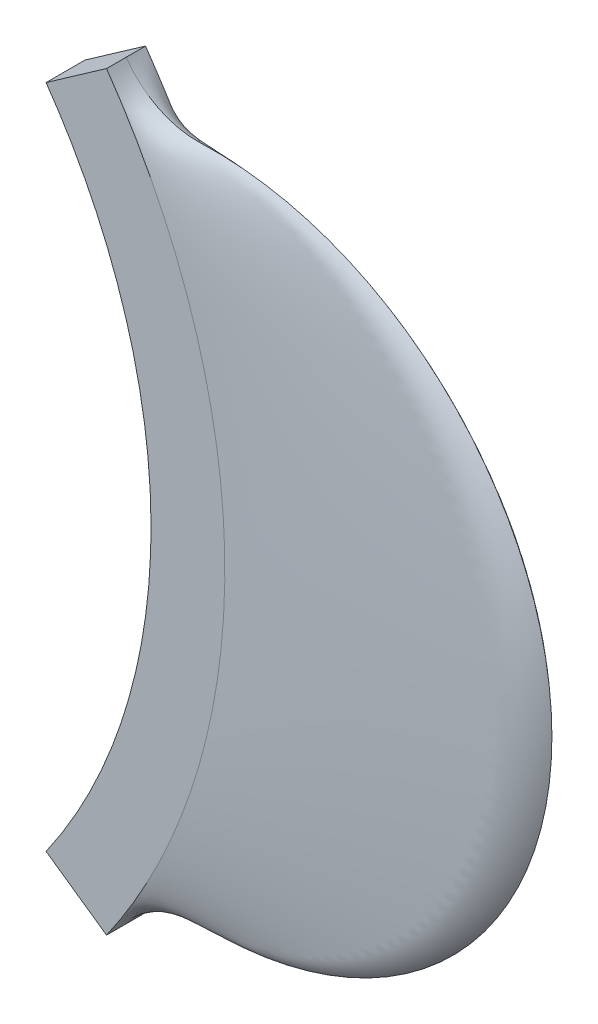
ISO-10303-21;
HEADER;
FILE_DESCRIPTION(('STEP AP214'),'2;1');
FILE_NAME('part.step','',(''),(''),'','','');
FILE_SCHEMA(('AUTOMOTIVE_DESIGN { 1 0 10303 214 1 1 1 1 }'));
ENDSEC;
DATA;
#1=APPLICATION_CONTEXT('core data for automotive mechanical design processes');
#2=APPLICATION_PROTOCOL_DEFINITION('international standard','automotive_design',2000,#1);
#3=PRODUCT_CONTEXT('',#1,'mechanical');
#4=PRODUCT('Part','Part','',(#3));
#5=PRODUCT_RELATED_PRODUCT_CATEGORY('part','',(#4));
#6=PRODUCT_DEFINITION_FORMATION('','',#4);
#7=PRODUCT_DEFINITION_CONTEXT('part definition',#1,'design');
#8=PRODUCT_DEFINITION('design','',#6,#7);
#9=PRODUCT_DEFINITION_SHAPE('','',#8);
#10=(LENGTH_UNIT() NAMED_UNIT(*) SI_UNIT(.MILLI.,.METRE.));
#11=(NAMED_UNIT(*) PLANE_ANGLE_UNIT() SI_UNIT($,.RADIAN.));
#12=(NAMED_UNIT(*) SI_UNIT($,.STERADIAN.) SOLID_ANGLE_UNIT());
#13=UNCERTAINTY_MEASURE_WITH_UNIT(LENGTH_MEASURE(1.E-05),#10,'distance_accuracy_value','');
#14=(GEOMETRIC_REPRESENTATION_CONTEXT(3) GLOBAL_UNCERTAINTY_ASSIGNED_CONTEXT((#13)) GLOBAL_UNIT_ASSIGNED_CONTEXT((#10,
#11,#12)) REPRESENTATION_CONTEXT('',''));
#15=CARTESIAN_POINT('',(0.,0.,0.));
#16=DIRECTION('',(0.,0.,1.));
#17=DIRECTION('',(1.,0.,0.));
#18=AXIS2_PLACEMENT_3D('',#15,#16,#17);
#19=CARTESIAN_POINT('',(2.08166817117217E-13,0.,0.));
#20=DIRECTION('',(0.,0.,1.));
#21=DIRECTION('',(1.,0.,0.));
#22=AXIS2_PLACEMENT_3D('',#19,#20,#21);
#23=PLANE('',#22);
#24=CARTESIAN_POINT('',(2.08166817117217E-13,0.,0.));
#25=DIRECTION('',(0.,0.,-1.));
#26=DIRECTION('',(1.,0.,0.));
#27=AXIS2_PLACEMENT_3D('',#24,#25,#26);
#28=CIRCLE('',#27,94.3660254037843);
#29=CARTESIAN_POINT('',(77.3001226209369,54.1261285637151,0.));
#30=VERTEX_POINT('',#29);
#31=CARTESIAN_POINT('',(77.3001226209369,-54.1261285637151,0.));
#32=VERTEX_POINT('',#31);
#33=EDGE_CURVE('E438',#30,#32,#28,.T.);
#34=ORIENTED_EDGE('',*,*,#33,.F.);
#35=DIRECTION('',(-0.819152044288992,-0.573576436351046,0.));
#36=VECTOR('',#35,1.);
#37=CARTESIAN_POINT('',(77.3001226209369,54.1261285637151,0.));
#38=LINE('',#37,#36);
#39=CARTESIAN_POINT('',(87.1299471524047,61.0090457999276,0.));
#40=VERTEX_POINT('',#39);
#41=EDGE_CURVE('E206',#40,#30,#38,.T.);
#42=ORIENTED_EDGE('',*,*,#41,.F.);
#43=CARTESIAN_POINT('',(2.08166817117217E-13,0.,0.));
#44=DIRECTION('',(0.,0.,1.));
#45=DIRECTION('',(1.,0.,0.));
#46=AXIS2_PLACEMENT_3D('',#43,#44,#45);
#47=CIRCLE('',#46,106.366025403784);
#48=CARTESIAN_POINT('',(87.1299471524048,-61.0090457999277,0.));
#49=VERTEX_POINT('',#48);
#50=EDGE_CURVE('E146',#49,#40,#47,.T.);
#51=ORIENTED_EDGE('',*,*,#50,.F.);
#52=DIRECTION('',(0.819152044288991,-0.573576436351047,0.));
#53=VECTOR('',#52,1.);
#54=CARTESIAN_POINT('',(77.3001226209369,-54.1261285637151,0.));
#55=LINE('',#54,#53);
#56=EDGE_CURVE('E13',#32,#49,#55,.T.);
#57=ORIENTED_EDGE('',*,*,#56,.F.);
#58=EDGE_LOOP('',(#34,#42,#51,#57));
#59=FACE_BOUND('',#58,.T.);
#60=ADVANCED_FACE('F135',(#59),#23,.F.);
#61=CARTESIAN_POINT('',(77.3001226209369,54.1261285637151,3.175));
#62=DIRECTION('',(-0.573576436351046,0.819152044288992,0.));
#63=DIRECTION('',(0.819152044288992,0.573576436351046,0.));
#64=AXIS2_PLACEMENT_3D('',#61,#62,#63);
#65=PLANE('',#64);
#66=DIRECTION('',(0.,0.,-1.));
#67=VECTOR('',#66,1.);
#68=CARTESIAN_POINT('',(77.3001226209369,54.1261285637151,1.5875));
#69=LINE('',#68,#67);
#70=CARTESIAN_POINT('',(77.3001226209369,54.1261285637151,3.175));
#71=VERTEX_POINT('',#70);
#72=EDGE_CURVE('E197',#71,#30,#69,.T.);
#73=ORIENTED_EDGE('',*,*,#72,.F.);
#74=DIRECTION('',(0.,0.,1.));
#75=VECTOR('',#74,1.);
#76=CARTESIAN_POINT('',(77.3001226209369,54.1261285637151,4.7625));
#77=LINE('',#76,#75);
#78=CARTESIAN_POINT('',(77.3001226209369,54.1261285637151,6.35));
#79=VERTEX_POINT('',#78);
#80=EDGE_CURVE('E202',#71,#79,#77,.T.);
#81=ORIENTED_EDGE('',*,*,#80,.T.);
#82=CARTESIAN_POINT('',(87.1299471524047,61.0090457999276,6.35));
#83=DIRECTION('',(-0.819152044288992,-0.573576436351045,0.));
#84=VECTOR('',#83,1.);
#85=LINE('',#82,#84);
#86=CARTESIAN_POINT('',(87.1299471524047,61.0090457999276,6.35));
#87=VERTEX_POINT('',#86);
#88=EDGE_CURVE('E335',#87,#79,#85,.T.);
#89=ORIENTED_EDGE('',*,*,#88,.F.);
#90=DIRECTION('',(0.,0.,1.));
#91=VECTOR('',#90,1.);
#92=CARTESIAN_POINT('',(87.1299471524048,61.0090457999277,4.7625));
#93=LINE('',#92,#91);
#94=CARTESIAN_POINT('',(87.1299471524048,61.0090457999277,3.175));
#95=VERTEX_POINT('',#94);
#96=EDGE_CURVE('E230',#95,#87,#93,.T.);
#97=ORIENTED_EDGE('',*,*,#96,.F.);
#98=DIRECTION('',(0.,0.,-1.));
#99=VECTOR('',#98,1.);
#100=CARTESIAN_POINT('',(87.1299471524048,61.0090457999277,1.5875));
#101=LINE('',#100,#99);
#102=EDGE_CURVE('E209',#95,#40,#101,.T.);
#103=ORIENTED_EDGE('',*,*,#102,.T.);
#104=ORIENTED_EDGE('',*,*,#41,.T.);
#105=EDGE_LOOP('',(#73,#81,#89,#97,#103,#104));
#106=FACE_BOUND('',#105,.T.);
#107=ADVANCED_FACE('F199',(#106),#65,.T.);
#108=CARTESIAN_POINT('',(77.3001226209369,-54.1261285637151,3.175));
#109=CARTESIAN_POINT('',(77.3001226209369,-54.1261285637151,3.0281756079608));
#110=CARTESIAN_POINT('',(77.3001226209369,-54.1261285637151,2.8813512159216));
#111=CARTESIAN_POINT('',(77.3001226209369,-54.1261285637151,1.82301788258827));
#112=CARTESIAN_POINT('',(77.3001226209369,-54.1261285637151,0.911508941294133));
#113=CARTESIAN_POINT('',(77.3001226209369,-54.1261285637151,0.));
#114=CARTESIAN_POINT('',(80.055436798701,-50.191132112793,3.175));
#115=CARTESIAN_POINT('',(80.055436798701,-50.191132112793,3.0281756079608));
#116=CARTESIAN_POINT('',(80.055436798701,-50.191132112793,2.8813512159216));
#117=CARTESIAN_POINT('',(80.055436798701,-50.191132112793,1.82301788258827));
#118=CARTESIAN_POINT('',(80.055436798701,-50.191132112793,0.911508941294133));
#119=CARTESIAN_POINT('',(80.055436798701,-50.191132112793,0.));
#120=CARTESIAN_POINT('',(84.9640400716013,-41.8996473461581,3.17499999999999));
#121=CARTESIAN_POINT('',(84.9640400716013,-41.8996473461581,3.02817560796079));
#122=CARTESIAN_POINT('',(84.9640400716013,-41.8996473461581,2.88135121592159));
#123=CARTESIAN_POINT('',(84.9640400716013,-41.8996473461581,1.82301788258826));
#124=CARTESIAN_POINT('',(84.9640400716013,-41.8996473461581,0.911508941294131));
#125=CARTESIAN_POINT('',(84.9640400716013,-41.8996473461581,0.));
#126=CARTESIAN_POINT('',(90.349032062118,-28.4869304821183,3.17500000000001));
#127=CARTESIAN_POINT('',(90.349032062118,-28.4869304821183,3.02817560796081));
#128=CARTESIAN_POINT('',(90.349032062118,-28.4869304821183,2.88135121592161));
#129=CARTESIAN_POINT('',(90.3490320621181,-28.4869304821183,1.82301788258827));
#130=CARTESIAN_POINT('',(90.3490320621182,-28.4869304821183,0.911508941294135));
#131=CARTESIAN_POINT('',(90.3490320621183,-28.4869304821184,0.));
#132=CARTESIAN_POINT('',(93.6310738350607,-14.4112069168914,3.17499999999999));
#133=CARTESIAN_POINT('',(93.6310738350606,-14.4112069168914,3.02817560796079));
#134=CARTESIAN_POINT('',(93.6310738350606,-14.4112069168914,2.88135121592159));
#135=CARTESIAN_POINT('',(93.6310738350604,-14.4112069168914,1.82301788258826));
#136=CARTESIAN_POINT('',(93.6310738350602,-14.4112069168914,0.911508941294131));
#137=CARTESIAN_POINT('',(93.63107383506,-14.4112069168914,0.));
#138=CARTESIAN_POINT('',(94.7336039840116,0.,3.175));
#139=CARTESIAN_POINT('',(94.7336039840116,0.,3.0281756079608));
#140=CARTESIAN_POINT('',(94.7336039840116,0.,2.8813512159216));
#141=CARTESIAN_POINT('',(94.7336039840119,0.,1.82301788258827));
#142=CARTESIAN_POINT('',(94.7336039840121,0.,0.911508941294134));
#143=CARTESIAN_POINT('',(94.7336039840124,0.,0.));
#144=CARTESIAN_POINT('',(93.6310738350608,14.4112069168916,3.175));
#145=CARTESIAN_POINT('',(93.6310738350607,14.4112069168916,3.0281756079608));
#146=CARTESIAN_POINT('',(93.6310738350607,14.4112069168916,2.8813512159216));
#147=CARTESIAN_POINT('',(93.6310738350605,14.4112069168915,1.82301788258827));
#148=CARTESIAN_POINT('',(93.6310738350603,14.4112069168915,0.911508941294133));
#149=CARTESIAN_POINT('',(93.6310738350601,14.4112069168914,0.));
#150=CARTESIAN_POINT('',(90.3490320621178,28.4869304821183,3.175));
#151=CARTESIAN_POINT('',(90.3490320621179,28.4869304821183,3.0281756079608));
#152=CARTESIAN_POINT('',(90.3490320621179,28.4869304821183,2.8813512159216));
#153=CARTESIAN_POINT('',(90.3490320621181,28.4869304821183,1.82301788258827));
#154=CARTESIAN_POINT('',(90.3490320621182,28.4869304821184,0.911508941294134));
#155=CARTESIAN_POINT('',(90.3490320621184,28.4869304821184,0.));
#156=CARTESIAN_POINT('',(84.9640400716016,41.8996473461583,3.175));
#157=CARTESIAN_POINT('',(84.9640400716015,41.8996473461583,3.0281756079608));
#158=CARTESIAN_POINT('',(84.9640400716015,41.8996473461583,2.8813512159216));
#159=CARTESIAN_POINT('',(84.9640400716014,41.8996473461582,1.82301788258827));
#160=CARTESIAN_POINT('',(84.9640400716013,41.8996473461582,0.911508941294133));
#161=CARTESIAN_POINT('',(84.9640400716012,41.8996473461581,0.));
#162=CARTESIAN_POINT('',(80.055436798701,50.191132112793,3.175));
#163=CARTESIAN_POINT('',(80.055436798701,50.191132112793,3.0281756079608));
#164=CARTESIAN_POINT('',(80.055436798701,50.191132112793,2.8813512159216));
#165=CARTESIAN_POINT('',(80.055436798701,50.191132112793,1.82301788258827));
#166=CARTESIAN_POINT('',(80.055436798701,50.191132112793,0.911508941294133));
#167=CARTESIAN_POINT('',(80.055436798701,50.191132112793,0.));
#168=CARTESIAN_POINT('',(77.3001226209369,54.1261285637151,3.175));
#169=CARTESIAN_POINT('',(77.3001226209369,54.1261285637151,3.0281756079608));
#170=CARTESIAN_POINT('',(77.3001226209369,54.1261285637151,2.8813512159216));
#171=CARTESIAN_POINT('',(77.3001226209369,54.1261285637151,1.82301788258827));
#172=CARTESIAN_POINT('',(77.3001226209369,54.1261285637151,0.911508941294133));
#173=CARTESIAN_POINT('',(77.3001226209369,54.1261285637151,0.));
#174=B_SPLINE_SURFACE_WITH_KNOTS('',3,3,((#108,#109,#110,#111,#112,#113),(#114,#115,#116,#117,
#118,#119),(#120,#121,#122,#123,#124,#125),(#126,#127,#128,#129,#130,#131),(#132,#133,#134,#135,
#136,#137),(#138,#139,#140,#141,#142,#143),(#144,#145,#146,#147,#148,#149),(#150,#151,#152,#153,
#154,#155),(#156,#157,#158,#159,#160,#161),(#162,#163,#164,#165,#166,#167),(#168,#169,#170,#171,
#172,#173)),.UNSPECIFIED.,.F.,.F.,.F.,(4,1,1,1,1,1,1,1,4),(4,2,4),(0.0861512886353095,
0.189613466476482,0.293075644317655,0.396537822158827,0.5,0.603462177841173,0.706924355682345,
0.810386533523518,0.91384871136469),(0.,0.138731709013417,1.),.UNSPECIFIED.);
#175=CARTESIAN_POINT('',(0.,0.,3.175));
#176=DIRECTION('',(0.,0.,-1.));
#177=DIRECTION('',(1.,0.,0.));
#178=AXIS2_PLACEMENT_3D('',#175,#176,#177);
#179=CIRCLE('',#178,94.3660254037844);
#180=CARTESIAN_POINT('',(77.3001226209369,-54.1261285637151,3.175));
#181=VERTEX_POINT('',#180);
#182=EDGE_CURVE('E213',#71,#181,#179,.T.);
#183=DIRECTION('',(0.,0.,-1.));
#184=VECTOR('',#183,1.);
#185=CARTESIAN_POINT('',(77.3001226209369,-54.1261285637151,1.5875));
#186=LINE('',#185,#184);
#187=EDGE_CURVE('E210',#181,#32,#186,.T.);
#188=ORIENTED_EDGE('',*,*,#182,.F.);
#189=ORIENTED_EDGE('',*,*,#72,.T.);
#190=ORIENTED_EDGE('',*,*,#33,.T.);
#191=ORIENTED_EDGE('',*,*,#187,.F.);
#192=EDGE_LOOP('',(#188,#189,#190,#191));
#193=FACE_BOUND('',#192,.T.);
#194=ADVANCED_FACE('F215',(#193),#174,.T.);
#195=CARTESIAN_POINT('',(87.1299471524048,-61.0090457999277,3.175));
#196=DIRECTION('',(-0.573576436351047,-0.819152044288991,0.));
#197=DIRECTION('',(-0.819152044288991,0.573576436351047,0.));
#198=AXIS2_PLACEMENT_3D('',#195,#196,#197);
#199=PLANE('',#198);
#200=DIRECTION('',(0.,0.,-1.));
#201=VECTOR('',#200,1.);
#202=CARTESIAN_POINT('',(87.1299471524048,-61.0090457999277,1.5875));
#203=LINE('',#202,#201);
#204=CARTESIAN_POINT('',(87.1299471524048,-61.0090457999277,3.175));
#205=VERTEX_POINT('',#204);
#206=EDGE_CURVE('E154',#205,#49,#203,.T.);
#207=ORIENTED_EDGE('',*,*,#206,.F.);
#208=DIRECTION('',(0.,0.,1.));
#209=VECTOR('',#208,1.);
#210=CARTESIAN_POINT('',(87.1299471524048,-61.0090457999277,4.7625));
#211=LINE('',#210,#209);
#212=CARTESIAN_POINT('',(87.1299471524048,-61.0090457999277,6.35));
#213=VERTEX_POINT('',#212);
#214=EDGE_CURVE('E234',#205,#213,#211,.T.);
#215=ORIENTED_EDGE('',*,*,#214,.T.);
#216=CARTESIAN_POINT('',(77.3001226209369,-54.1261285637151,6.35));
#217=DIRECTION('',(0.819152044288991,-0.573576436351047,0.));
#218=VECTOR('',#217,1.);
#219=LINE('',#216,#218);
#220=CARTESIAN_POINT('',(77.3001226209369,-54.1261285637151,6.35));
#221=VERTEX_POINT('',#220);
#222=EDGE_CURVE('E221',#221,#213,#219,.T.);
#223=ORIENTED_EDGE('',*,*,#222,.F.);
#224=DIRECTION('',(0.,0.,1.));
#225=VECTOR('',#224,1.);
#226=CARTESIAN_POINT('',(77.3001226209369,-54.1261285637151,4.7625));
#227=LINE('',#226,#225);
#228=EDGE_CURVE('E231',#181,#221,#227,.T.);
#229=ORIENTED_EDGE('',*,*,#228,.F.);
#230=ORIENTED_EDGE('',*,*,#187,.T.);
#231=ORIENTED_EDGE('',*,*,#56,.T.);
#232=EDGE_LOOP('',(#207,#215,#223,#229,#230,#231));
#233=FACE_BOUND('',#232,.T.);
#234=ADVANCED_FACE('F359',(#233),#199,.T.);
#235=CARTESIAN_POINT('',(87.1299471524048,61.0090457999277,3.175));
#236=CARTESIAN_POINT('',(87.1299471524048,61.0090457999277,3.0281756079608));
#237=CARTESIAN_POINT('',(87.1299471524048,61.0090457999277,2.8813512159216));
#238=CARTESIAN_POINT('',(87.1299471524047,61.0090457999275,1.82301788258826));
#239=CARTESIAN_POINT('',(87.1299471524047,61.0090457999276,0.911508941294133));
#240=CARTESIAN_POINT('',(87.1299471524047,61.0090457999276,0.));
#241=CARTESIAN_POINT('',(87.803313766193,60.0473786126392,3.175));
#242=CARTESIAN_POINT('',(87.7930797969314,60.0619942354413,3.0281756079608));
#243=CARTESIAN_POINT('',(87.7828458276699,60.0766098582433,2.8813512159216));
#244=CARTESIAN_POINT('',(87.7090777660319,60.1819615684324,1.82301788258826));
#245=CARTESIAN_POINT('',(87.6455436736558,60.2726976558197,0.911508941294133));
#246=CARTESIAN_POINT('',(87.5820095812796,60.3634337432069,0.));
#247=CARTESIAN_POINT('',(89.3812948487653,58.3052215338683,3.175));
#248=CARTESIAN_POINT('',(89.3411440613296,58.3397336511201,3.02436454269294));
#249=CARTESIAN_POINT('',(89.2995419895995,58.374245768372,2.8755020453143));
#250=CARTESIAN_POINT('',(88.9976711324947,58.6230145429891,1.8188719534916));
#251=CARTESIAN_POINT('',(88.7391503003198,58.8372712003546,0.909244667411953));
#252=CARTESIAN_POINT('',(88.4791498319719,59.0515278577201,0.));
#253=CARTESIAN_POINT('',(92.3050616818892,56.3556686135344,3.175));
#254=CARTESIAN_POINT('',(92.1968401400165,56.3875713140972,3.00802062207226));
#255=CARTESIAN_POINT('',(92.0809434174732,56.41947401466,2.8504176205188));
#256=CARTESIAN_POINT('',(91.2349826237456,56.6494337029648,1.80109195464819));
#257=CARTESIAN_POINT('',(90.5141626797517,56.8474906907071,0.899534229517888));
#258=CARTESIAN_POINT('',(89.7855176149355,57.0455476784494,0.));
#259=CARTESIAN_POINT('',(95.6380439813342,55.1725992437705,3.175));
#260=CARTESIAN_POINT('',(95.4442694263398,55.1659135852535,2.9818552518174));
#261=CARTESIAN_POINT('',(95.2328557073146,55.1592279267364,2.81025936977606));
#262=CARTESIAN_POINT('',(93.6846856208011,55.1110366475791,1.77262753269791));
#263=CARTESIAN_POINT('',(92.36917418328,55.069531026939,0.883988559128766));
#264=CARTESIAN_POINT('',(91.0356789880245,55.0280254062988,0.));
#265=CARTESIAN_POINT('',(98.0254626926317,54.9540878466485,3.175));
#266=CARTESIAN_POINT('',(97.7673325839329,54.8957496754654,2.95840128728118));
#267=CARTESIAN_POINT('',(97.4826318529401,54.8374115042823,2.77426254727431));
#268=CARTESIAN_POINT('',(95.393910176905,54.4169007818381,1.74711275738751));
#269=CARTESIAN_POINT('',(93.6218913726007,54.0547282305773,0.870053820256475));
#270=CARTESIAN_POINT('',(91.8227828698645,53.6925556793164,0.));
#271=CARTESIAN_POINT('',(102.901499182134,55.1398867608937,3.175));
#272=CARTESIAN_POINT('',(102.510903032089,54.9491310994061,2.90540690433583));
#273=CARTESIAN_POINT('',(102.073555572655,54.7583754379184,2.69292749649738));
#274=CARTESIAN_POINT('',(98.8567690824435,53.3833785980163,1.68946195931133));
#275=CARTESIAN_POINT('',(96.1336381789742,52.1991374196021,0.838568188609798));
#276=CARTESIAN_POINT('',(93.3628426458004,51.0148962411878,0.));
#277=CARTESIAN_POINT('',(110.279787768618,54.6825066323353,3.175));
#278=CARTESIAN_POINT('',(109.692247272512,54.3231811602195,2.80020455294495));
#279=CARTESIAN_POINT('',(109.01789356579,53.9638556881038,2.53146437311214));
#280=CARTESIAN_POINT('',(104.037614398635,51.3737811141575,1.5750158769137));
#281=CARTESIAN_POINT('',(99.8362483479639,49.1430320123273,0.776064158934173));
#282=CARTESIAN_POINT('',(95.5463731284263,46.9122829104969,0.));
#283=CARTESIAN_POINT('',(121.007455091683,51.7986744552114,3.17499999999999));
#284=CARTESIAN_POINT('',(120.142981725646,51.2794762044392,2.58898230287498));
#285=CARTESIAN_POINT('',(119.111260017958,50.760277953667,2.20728336599721));
#286=CARTESIAN_POINT('',(111.444359067087,47.0178152213583,1.34523433005547));
#287=CARTESIAN_POINT('',(105.010616768378,43.794550739822,0.650570368995281));
#288=CARTESIAN_POINT('',(98.4063588118717,40.5712862582855,0.));
#289=CARTESIAN_POINT('',(130.957087432339,46.8248400084104,3.17500000000001));
#290=CARTESIAN_POINT('',(129.844643111399,46.2349150895345,2.34713496041177));
#291=CARTESIAN_POINT('',(128.472853036367,45.6449901706586,1.8360993878802));
#292=CARTESIAN_POINT('',(118.227984641784,41.3927184797012,1.08213678026445));
#293=CARTESIAN_POINT('',(109.66726706525,37.7303717076197,0.506881247312757));
#294=CARTESIAN_POINT('',(100.84213722956,34.0680249355383,0.));
#295=CARTESIAN_POINT('',(139.720372916799,39.9562148686776,3.175));
#296=CARTESIAN_POINT('',(138.398109442489,39.3768449064023,2.0974561561456));
#297=CARTESIAN_POINT('',(136.721420518026,38.797474944127,1.45289578979597));
#298=CARTESIAN_POINT('',(124.147989286727,34.621285042082,0.810519647869587));
#299=CARTESIAN_POINT('',(113.678123438081,31.0244651023124,0.358539207568393));
#300=CARTESIAN_POINT('',(102.846908184256,27.4276451625427,0.));
#301=CARTESIAN_POINT('',(146.936921009326,31.4691090952231,3.175));
#302=CARTESIAN_POINT('',(145.449963999971,30.9699609180474,1.86273952066686));
#303=CARTESIAN_POINT('',(143.519199558571,30.4708127408717,1.09265592277949));
#304=CARTESIAN_POINT('',(128.991386585197,26.8728740956593,0.555179353199869));
#305=CARTESIAN_POINT('',(116.928867796013,23.7740836276228,0.21908666344401));
#306=CARTESIAN_POINT('',(104.413871478724,20.6752931595862,0.));
#307=CARTESIAN_POINT('',(152.310228818401,21.7084700878949,3.17499999999999));
#308=CARTESIAN_POINT('',(150.707813788527,21.3444370225864,1.66577868456587));
#309=CARTESIAN_POINT('',(148.586587056675,20.9804039572779,0.790363137865656));
#310=CARTESIAN_POINT('',(132.582706332982,18.3563963104517,0.340912316584247));
#311=CARTESIAN_POINT('',(119.324918590764,16.096421728934,0.102066028621407));
#312=CARTESIAN_POINT('',(105.538183788371,13.8364471474163,0.));
#313=CARTESIAN_POINT('',(155.621615325174,11.0730534860741,3.17500000000001));
#314=CARTESIAN_POINT('',(153.953488898378,10.8817670546595,1.52936727843302));
#315=CARTESIAN_POINT('',(151.714604209411,10.6904806232449,0.581000786089433));
#316=CARTESIAN_POINT('',(134.791162000054,9.31165791014685,0.192514958351711));
#317=CARTESIAN_POINT('',(120.794036111144,8.12412162846343,0.0210197167824046));
#318=CARTESIAN_POINT('',(106.215001788608,6.93658534678001,0.));
#319=CARTESIAN_POINT('',(156.366025403784,3.68969785289263,3.175));
#320=CARTESIAN_POINT('',(154.685013785168,3.62604465592125,1.49398838138341));
#321=CARTESIAN_POINT('',(152.419771335941,3.56239145894986,0.526701741020282));
#322=CARTESIAN_POINT('',(135.287803633226,3.10356919384513,0.154027452004706));
#323=CARTESIAN_POINT('',(121.124736617675,2.70840012571178,0.));
#324=CARTESIAN_POINT('',(106.366025403784,2.31323105757843,0.));
#325=CARTESIAN_POINT('',(156.366025403784,-3.68969785289264,3.175));
#326=CARTESIAN_POINT('',(154.685013785168,-3.62604465592125,1.49398838138341));
#327=CARTESIAN_POINT('',(152.419771335941,-3.56239145894986,0.526701741020281));
#328=CARTESIAN_POINT('',(135.287803633226,-3.10356919384513,0.154027452004706));
#329=CARTESIAN_POINT('',(121.124736617675,-2.70840012571179,0.));
#330=CARTESIAN_POINT('',(106.366025403784,-2.31323105757845,0.));
#331=CARTESIAN_POINT('',(155.621615325174,-11.0730534860742,3.175));
#332=CARTESIAN_POINT('',(153.953488898378,-10.8817670546596,1.52936727843301));
#333=CARTESIAN_POINT('',(151.714604209411,-10.690480623245,0.581000786089427));
#334=CARTESIAN_POINT('',(134.791162000054,-9.3116579101469,0.192514958351709));
#335=CARTESIAN_POINT('',(120.794036111144,-8.12412162846346,0.021019716782403));
#336=CARTESIAN_POINT('',(106.215001788608,-6.93658534678002,0.));
#337=CARTESIAN_POINT('',(152.310228818401,-21.7084700878948,3.17500000000001));
#338=CARTESIAN_POINT('',(150.707813788528,-21.3444370225863,1.66577868456589));
#339=CARTESIAN_POINT('',(148.586587056675,-20.9804039572779,0.790363137865669));
#340=CARTESIAN_POINT('',(132.582706332982,-18.3563963104517,0.340912316584258));
#341=CARTESIAN_POINT('',(119.324918590764,-16.096421728934,0.102066028621412));
#342=CARTESIAN_POINT('',(105.538183788371,-13.8364471474163,0.));
#343=CARTESIAN_POINT('',(146.936921009326,-31.4691090952232,3.175));
#344=CARTESIAN_POINT('',(145.449963999971,-30.9699609180475,1.86273952066685));
#345=CARTESIAN_POINT('',(143.519199558571,-30.4708127408717,1.09265592277948));
#346=CARTESIAN_POINT('',(128.991386585197,-26.8728740956594,0.555179353199869));
#347=CARTESIAN_POINT('',(116.928867796013,-23.7740836276228,0.219086663444009));
#348=CARTESIAN_POINT('',(104.413871478724,-20.6752931595863,0.));
#349=CARTESIAN_POINT('',(139.720372916799,-39.9562148686775,3.175));
#350=CARTESIAN_POINT('',(138.398109442489,-39.3768449064022,2.0974561561456));
#351=CARTESIAN_POINT('',(136.721420518026,-38.797474944127,1.45289578979597));
#352=CARTESIAN_POINT('',(124.147989286727,-34.6212850420819,0.81051964786959));
#353=CARTESIAN_POINT('',(113.678123438081,-31.0244651023123,0.358539207568394));
#354=CARTESIAN_POINT('',(102.846908184256,-27.4276451625427,0.));
#355=CARTESIAN_POINT('',(130.957087432339,-46.8248400084104,3.17500000000001));
#356=CARTESIAN_POINT('',(129.8446431114,-46.2349150895345,2.34713496041177));
#357=CARTESIAN_POINT('',(128.472853036367,-45.6449901706586,1.8360993878802));
#358=CARTESIAN_POINT('',(118.227984641784,-41.3927184797011,1.08213678026445));
#359=CARTESIAN_POINT('',(109.66726706525,-37.7303717076197,0.506881247312758));
#360=CARTESIAN_POINT('',(100.84213722956,-34.0680249355383,0.));
#361=CARTESIAN_POINT('',(121.007455091683,-51.7986744552113,3.17499999999999));
#362=CARTESIAN_POINT('',(120.142981725646,-51.2794762044391,2.58898230287498));
#363=CARTESIAN_POINT('',(119.111260017957,-50.7602779536669,2.20728336599721));
#364=CARTESIAN_POINT('',(111.444359067087,-47.0178152213582,1.34523433005546));
#365=CARTESIAN_POINT('',(105.010616768378,-43.7945507398219,0.65057036899528));
#366=CARTESIAN_POINT('',(98.4063588118716,-40.5712862582855,0.));
#367=CARTESIAN_POINT('',(110.279787768618,-54.6825066323354,3.17500000000001));
#368=CARTESIAN_POINT('',(109.692247272513,-54.3231811602197,2.80020455294496));
#369=CARTESIAN_POINT('',(109.01789356579,-53.9638556881039,2.53146437311214));
#370=CARTESIAN_POINT('',(104.037614398635,-51.3737811141576,1.5750158769137));
#371=CARTESIAN_POINT('',(99.836248347964,-49.1430320123273,0.776064158934175));
#372=CARTESIAN_POINT('',(95.5463731284263,-46.9122829104969,0.));
#373=CARTESIAN_POINT('',(102.901499182134,-55.1398867608937,3.175));
#374=CARTESIAN_POINT('',(102.510903032089,-54.9491310994061,2.90540690433583));
#375=CARTESIAN_POINT('',(102.073555572655,-54.7583754379184,2.69292749649738));
#376=CARTESIAN_POINT('',(98.8567690824435,-53.3833785980163,1.68946195931133));
#377=CARTESIAN_POINT('',(96.1336381789742,-52.199137419602,0.838568188609798));
#378=CARTESIAN_POINT('',(93.3628426458005,-51.0148962411878,0.));
#379=CARTESIAN_POINT('',(98.0254626926317,-54.9540878466485,3.175));
#380=CARTESIAN_POINT('',(97.767332583933,-54.8957496754654,2.95840128728118));
#381=CARTESIAN_POINT('',(97.4826318529401,-54.8374115042823,2.77426254727431));
#382=CARTESIAN_POINT('',(95.3939101769051,-54.4169007818381,1.74711275738751));
#383=CARTESIAN_POINT('',(93.6218913726008,-54.0547282305773,0.870053820256475));
#384=CARTESIAN_POINT('',(91.8227828698645,-53.6925556793165,0.));
#385=CARTESIAN_POINT('',(95.6380439813342,-55.1725992437705,3.17499999999999));
#386=CARTESIAN_POINT('',(95.4442693490305,-55.165913753248,2.9818552518174));
#387=CARTESIAN_POINT('',(95.2328555526958,-55.1592282627256,2.81025936977606));
#388=CARTESIAN_POINT('',(93.6846849089239,-55.1110381944994,1.7726275326979));
#389=CARTESIAN_POINT('',(92.3691729914539,-55.069533616796,0.883988559128765));
#390=CARTESIAN_POINT('',(91.0356773162494,-55.0280290390925,0.));
#391=CARTESIAN_POINT('',(92.3050616818892,-56.3556686135343,3.175));
#392=CARTESIAN_POINT('',(92.1968402087348,-56.3875711907864,3.00802062207226));
#393=CARTESIAN_POINT('',(92.0809435549097,-56.4194737680385,2.8504176205188));
#394=CARTESIAN_POINT('',(91.2349832565141,-56.6494325675005,1.80109195464819));
#395=CARTESIAN_POINT('',(90.514163739134,-56.8474887897107,0.899534229517888));
#396=CARTESIAN_POINT('',(89.7855191009314,-57.0455450119209,0.));
#397=CARTESIAN_POINT('',(89.3812948487653,-58.3052215338683,3.175));
#398=CARTESIAN_POINT('',(89.3411440522858,-58.3397336611281,3.02436454269294));
#399=CARTESIAN_POINT('',(89.2995419715116,-58.3742457883879,2.8755020453143));
#400=CARTESIAN_POINT('',(88.9976710492166,-58.623014635144,1.8188719534916));
#401=CARTESIAN_POINT('',(88.7391501608953,-58.8372713546406,0.909244667411953));
#402=CARTESIAN_POINT('',(88.4791496364011,-59.0515280741371,0.));
#403=CARTESIAN_POINT('',(87.8033137661931,-60.0473786126392,3.175));
#404=CARTESIAN_POINT('',(87.7930797969315,-60.0619942354413,3.0281756079608));
#405=CARTESIAN_POINT('',(87.7828458276699,-60.0766098582434,2.8813512159216));
#406=CARTESIAN_POINT('',(87.709077766032,-60.1819615684324,1.82301788258826));
#407=CARTESIAN_POINT('',(87.6455436736559,-60.2726976558197,0.911508941294133));
#408=CARTESIAN_POINT('',(87.5820095812796,-60.363433743207,0.));
#409=CARTESIAN_POINT('',(87.1299471524048,-61.0090457999277,3.175));
#410=CARTESIAN_POINT('',(87.1299471524048,-61.0090457999277,3.0281756079608));
#411=CARTESIAN_POINT('',(87.1299471524048,-61.0090457999277,2.8813512159216));
#412=CARTESIAN_POINT('',(87.1299471524047,-61.0090457999275,1.82301788258826));
#413=CARTESIAN_POINT('',(87.1299471524048,-61.0090457999276,0.911508941294133));
#414=CARTESIAN_POINT('',(87.1299471524047,-61.0090457999277,0.));
#415=B_SPLINE_SURFACE_WITH_KNOTS('',3,3,((#235,#236,#237,#238,#239,#240),(#241,#242,#243,#244,
#245,#246),(#247,#248,#249,#250,#251,#252),(#253,#254,#255,#256,#257,#258),(#259,#260,#261,#262,
#263,#264),(#265,#266,#267,#268,#269,#270),(#271,#272,#273,#274,#275,#276),(#277,#278,#279,#280,
#281,#282),(#283,#284,#285,#286,#287,#288),(#289,#290,#291,#292,#293,#294),(#295,#296,#297,#298,
#299,#300),(#301,#302,#303,#304,#305,#306),(#307,#308,#309,#310,#311,#312),(#313,#314,#315,#316,
#317,#318),(#319,#320,#321,#322,#323,#324),(#325,#326,#327,#328,#329,#330),(#331,#332,#333,#334,
#335,#336),(#337,#338,#339,#340,#341,#342),(#343,#344,#345,#346,#347,#348),(#349,#350,#351,#352,
#353,#354),(#355,#356,#357,#358,#359,#360),(#361,#362,#363,#364,#365,#366),(#367,#368,#369,#370,
#371,#372),(#373,#374,#375,#376,#377,#378),(#379,#380,#381,#382,#383,#384),(#385,#386,#387,#388,
#389,#390),(#391,#392,#393,#394,#395,#396),(#397,#398,#399,#400,#401,#402),(#403,#404,#405,#406,
#407,#408),(#409,#410,#411,#412,#413,#414)),.UNSPECIFIED.,.F.,.F.,.F.,(4,1,1,1,2,1,1,1,1,1,1,1,
2,1,1,1,1,1,1,1,2,1,1,1,4),(4,2,4),(0.,0.0176213435540872,0.0352426871081743,0.0528640306622615,
0.0704853742163486,0.124174702439305,0.177864030662261,0.231553358885218,0.285242687108174,
0.338932015331131,0.392621343554087,0.446310671777044,0.5,0.553689328222956,0.607378656445913,
0.661067984668869,0.714757312891826,0.768446641114782,0.822135969337738,0.875825297560695,
0.929514625783651,0.947135969337738,0.964757312891826,0.982378656445913,1.),(0.,
0.138731709013417,1.),.UNSPECIFIED.);
#416=CARTESIAN_POINT('',(98.6928809522558,69.1054992104032,3.175));
#417=DIRECTION('',(0.,0.,-1.));
#418=DIRECTION('',(1.,0.,0.));
#419=AXIS2_PLACEMENT_3D('',#416,#417,#418);
#420=CIRCLE('',#419,14.115735754389);
#421=CARTESIAN_POINT('',(99.2303638943588,55.,3.175));
#422=VERTEX_POINT('',#421);
#423=EDGE_CURVE('E220',#422,#95,#420,.T.);
#424=CARTESIAN_POINT('',(101.326111189419,0.,3.175));
#425=DIRECTION('',(0.,0.,1.));
#426=DIRECTION('',(1.,0.,0.));
#427=AXIS2_PLACEMENT_3D('',#424,#425,#426);
#428=CIRCLE('',#427,55.0399142143658);
#429=CARTESIAN_POINT('',(99.2303638943589,-55.,3.175));
#430=VERTEX_POINT('',#429);
#431=EDGE_CURVE('E483',#430,#422,#428,.T.);
#432=CARTESIAN_POINT('',(98.6928809522558,-69.1054992104032,3.175));
#433=DIRECTION('',(0.,0.,-1.));
#434=DIRECTION('',(1.,0.,0.));
#435=AXIS2_PLACEMENT_3D('',#432,#433,#434);
#436=CIRCLE('',#435,14.115735754389);
#437=EDGE_CURVE('E354',#205,#430,#436,.T.);
#438=ORIENTED_EDGE('',*,*,#423,.F.);
#439=ORIENTED_EDGE('',*,*,#431,.F.);
#440=ORIENTED_EDGE('',*,*,#437,.F.);
#441=ORIENTED_EDGE('',*,*,#206,.T.);
#442=ORIENTED_EDGE('',*,*,#50,.T.);
#443=ORIENTED_EDGE('',*,*,#102,.F.);
#444=EDGE_LOOP('',(#438,#439,#440,#441,#442,#443));
#445=FACE_BOUND('',#444,.T.);
#446=ADVANCED_FACE('F394',(#445),#415,.T.);
#447=CARTESIAN_POINT('',(2.08166817117217E-13,0.,6.35));
#448=DIRECTION('',(0.,0.,-1.));
#449=DIRECTION('',(1.,0.,0.));
#450=AXIS2_PLACEMENT_3D('',#447,#448,#449);
#451=PLANE('',#450);
#452=CARTESIAN_POINT('',(77.3001226209369,-54.1261285637151,6.35));
#453=CARTESIAN_POINT('',(80.055436798701,-50.191132112793,6.35));
#454=CARTESIAN_POINT('',(84.9640400716013,-41.8996473461581,6.35));
#455=CARTESIAN_POINT('',(90.3490320621183,-28.4869304821184,6.35));
#456=CARTESIAN_POINT('',(93.63107383506,-14.4112069168914,6.35));
#457=CARTESIAN_POINT('',(94.7336039840124,0.,6.35));
#458=CARTESIAN_POINT('',(93.6310738350601,14.4112069168914,6.35));
#459=CARTESIAN_POINT('',(90.3490320621184,28.4869304821184,6.35));
#460=CARTESIAN_POINT('',(84.9640400716012,41.8996473461581,6.35));
#461=CARTESIAN_POINT('',(80.055436798701,50.191132112793,6.35));
#462=CARTESIAN_POINT('',(77.3001226209369,54.1261285637151,6.35));
#463=B_SPLINE_CURVE_WITH_KNOTS('',3,(#452,#453,#454,#455,#456,#457,#458,#459,#460,#461,#462),
.UNSPECIFIED.,.F.,.F.,(4,1,1,1,1,1,1,1,4),(0.0861512886353095,0.189613466476482,
0.293075644317655,0.396537822158827,0.5,0.603462177841173,0.706924355682345,0.810386533523518,
0.91384871136469),.UNSPECIFIED.);
#464=EDGE_CURVE('E228',#79,#221,#463,.F.);
#465=ORIENTED_EDGE('',*,*,#464,.T.);
#466=ORIENTED_EDGE('',*,*,#222,.T.);
#467=CARTESIAN_POINT('',(87.1299471524047,61.0090457999276,6.35));
#468=CARTESIAN_POINT('',(87.5820095812796,60.3634337432069,6.35));
#469=CARTESIAN_POINT('',(88.4791498319719,59.0515278577201,6.35));
#470=CARTESIAN_POINT('',(89.7855176149355,57.0455476784494,6.35));
#471=CARTESIAN_POINT('',(91.0356789880245,55.0280254062988,6.35));
#472=CARTESIAN_POINT('',(91.8227828698645,53.6925556793164,6.35));
#473=CARTESIAN_POINT('',(93.3628426458004,51.0148962411878,6.35));
#474=CARTESIAN_POINT('',(95.5463731284263,46.9122829104969,6.35));
#475=CARTESIAN_POINT('',(98.4063588118717,40.5712862582855,6.35));
#476=CARTESIAN_POINT('',(100.84213722956,34.0680249355383,6.35));
#477=CARTESIAN_POINT('',(102.846908184256,27.4276451625427,6.35));
#478=CARTESIAN_POINT('',(104.413871478724,20.6752931595862,6.35));
#479=CARTESIAN_POINT('',(105.538183788371,13.8364471474163,6.35));
#480=CARTESIAN_POINT('',(106.215001788608,6.93658534678001,6.35));
#481=CARTESIAN_POINT('',(106.366025403784,2.31323105757843,6.35));
#482=CARTESIAN_POINT('',(106.366025403784,-2.31323105757845,6.35));
#483=CARTESIAN_POINT('',(106.215001788608,-6.93658534678002,6.35));
#484=CARTESIAN_POINT('',(105.538183788371,-13.8364471474163,6.35));
#485=CARTESIAN_POINT('',(104.413871478724,-20.6752931595863,6.35));
#486=CARTESIAN_POINT('',(102.846908184256,-27.4276451625427,6.35));
#487=CARTESIAN_POINT('',(100.84213722956,-34.0680249355383,6.35));
#488=CARTESIAN_POINT('',(98.4063588118716,-40.5712862582855,6.35));
#489=CARTESIAN_POINT('',(95.5463731284263,-46.9122829104969,6.35));
#490=CARTESIAN_POINT('',(93.3628426458005,-51.0148962411878,6.35));
#491=CARTESIAN_POINT('',(91.8227828698645,-53.6925556793165,6.35));
#492=CARTESIAN_POINT('',(91.0356773162494,-55.0280290390925,6.35));
#493=CARTESIAN_POINT('',(89.7855191009314,-57.0455450119209,6.35));
#494=CARTESIAN_POINT('',(88.4791496364011,-59.0515280741371,6.35));
#495=CARTESIAN_POINT('',(87.5820095812796,-60.363433743207,6.35));
#496=CARTESIAN_POINT('',(87.1299471524047,-61.0090457999277,6.35));
#497=B_SPLINE_CURVE_WITH_KNOTS('',3,(#467,#468,#469,#470,#471,#472,#473,#474,#475,#476,#477,
#478,#479,#480,#481,#482,#483,#484,#485,#486,#487,#488,#489,#490,#491,#492,#493,#494,#495,#496),
.UNSPECIFIED.,.F.,.F.,(4,1,1,1,2,1,1,1,1,1,1,1,2,1,1,1,1,1,1,1,2,1,1,1,4),(0.,
0.0176213435540872,0.0352426871081743,0.0528640306622615,0.0704853742163486,0.124174702439305,
0.177864030662261,0.231553358885218,0.285242687108174,0.338932015331131,0.392621343554087,
0.446310671777044,0.5,0.553689328222956,0.607378656445913,0.661067984668869,0.714757312891826,
0.768446641114782,0.822135969337738,0.875825297560695,0.929514625783651,0.947135969337738,
0.964757312891826,0.982378656445913,1.),.UNSPECIFIED.);
#498=EDGE_CURVE('E304',#213,#87,#497,.F.);
#499=ORIENTED_EDGE('',*,*,#498,.T.);
#500=ORIENTED_EDGE('',*,*,#88,.T.);
#501=EDGE_LOOP('',(#465,#466,#499,#500));
#502=FACE_BOUND('',#501,.T.);
#503=ADVANCED_FACE('F268',(#502),#451,.F.);
#504=CARTESIAN_POINT('',(77.3001226209369,-54.1261285637151,3.175));
#505=CARTESIAN_POINT('',(77.3001226209369,-54.1261285637151,3.3218243920392));
#506=CARTESIAN_POINT('',(77.3001226209369,-54.1261285637151,3.4686487840784));
#507=CARTESIAN_POINT('',(77.3001226209369,-54.1261285637151,4.52698211741173));
#508=CARTESIAN_POINT('',(77.3001226209369,-54.1261285637151,5.43849105870587));
#509=CARTESIAN_POINT('',(77.3001226209369,-54.1261285637151,6.35));
#510=CARTESIAN_POINT('',(80.055436798701,-50.191132112793,3.175));
#511=CARTESIAN_POINT('',(80.055436798701,-50.191132112793,3.3218243920392));
#512=CARTESIAN_POINT('',(80.055436798701,-50.191132112793,3.4686487840784));
#513=CARTESIAN_POINT('',(80.055436798701,-50.191132112793,4.52698211741173));
#514=CARTESIAN_POINT('',(80.055436798701,-50.191132112793,5.43849105870587));
#515=CARTESIAN_POINT('',(80.055436798701,-50.191132112793,6.35));
#516=CARTESIAN_POINT('',(84.9640400716013,-41.8996473461581,3.17500000000001));
#517=CARTESIAN_POINT('',(84.9640400716013,-41.8996473461581,3.32182439203921));
#518=CARTESIAN_POINT('',(84.9640400716013,-41.8996473461581,3.46864878407841));
#519=CARTESIAN_POINT('',(84.9640400716013,-41.8996473461581,4.52698211741174));
#520=CARTESIAN_POINT('',(84.9640400716013,-41.8996473461581,5.43849105870587));
#521=CARTESIAN_POINT('',(84.9640400716013,-41.8996473461581,6.35));
#522=CARTESIAN_POINT('',(90.349032062118,-28.4869304821183,3.17499999999999));
#523=CARTESIAN_POINT('',(90.349032062118,-28.4869304821183,3.32182439203919));
#524=CARTESIAN_POINT('',(90.349032062118,-28.4869304821183,3.46864878407839));
#525=CARTESIAN_POINT('',(90.3490320621181,-28.4869304821183,4.52698211741173));
#526=CARTESIAN_POINT('',(90.3490320621182,-28.4869304821183,5.43849105870587));
#527=CARTESIAN_POINT('',(90.3490320621183,-28.4869304821184,6.35));
#528=CARTESIAN_POINT('',(93.6310738350607,-14.4112069168914,3.17500000000001));
#529=CARTESIAN_POINT('',(93.6310738350606,-14.4112069168914,3.32182439203921));
#530=CARTESIAN_POINT('',(93.6310738350606,-14.4112069168914,3.46864878407841));
#531=CARTESIAN_POINT('',(93.6310738350604,-14.4112069168914,4.52698211741174));
#532=CARTESIAN_POINT('',(93.6310738350602,-14.4112069168914,5.43849105870587));
#533=CARTESIAN_POINT('',(93.63107383506,-14.4112069168914,6.35));
#534=CARTESIAN_POINT('',(94.7336039840116,0.,3.175));
#535=CARTESIAN_POINT('',(94.7336039840116,0.,3.3218243920392));
#536=CARTESIAN_POINT('',(94.7336039840116,0.,3.4686487840784));
#537=CARTESIAN_POINT('',(94.7336039840119,0.,4.52698211741173));
#538=CARTESIAN_POINT('',(94.7336039840121,0.,5.43849105870587));
#539=CARTESIAN_POINT('',(94.7336039840124,0.,6.35));
#540=CARTESIAN_POINT('',(93.6310738350608,14.4112069168916,3.175));
#541=CARTESIAN_POINT('',(93.6310738350607,14.4112069168916,3.3218243920392));
#542=CARTESIAN_POINT('',(93.6310738350607,14.4112069168916,3.4686487840784));
#543=CARTESIAN_POINT('',(93.6310738350605,14.4112069168915,4.52698211741173));
#544=CARTESIAN_POINT('',(93.6310738350603,14.4112069168915,5.43849105870587));
#545=CARTESIAN_POINT('',(93.6310738350601,14.4112069168914,6.35));
#546=CARTESIAN_POINT('',(90.3490320621178,28.4869304821183,3.175));
#547=CARTESIAN_POINT('',(90.3490320621179,28.4869304821183,3.3218243920392));
#548=CARTESIAN_POINT('',(90.3490320621179,28.4869304821183,3.4686487840784));
#549=CARTESIAN_POINT('',(90.3490320621181,28.4869304821183,4.52698211741173));
#550=CARTESIAN_POINT('',(90.3490320621182,28.4869304821184,5.43849105870587));
#551=CARTESIAN_POINT('',(90.3490320621184,28.4869304821184,6.35));
#552=CARTESIAN_POINT('',(84.9640400716016,41.8996473461583,3.175));
#553=CARTESIAN_POINT('',(84.9640400716015,41.8996473461583,3.3218243920392));
#554=CARTESIAN_POINT('',(84.9640400716015,41.8996473461583,3.4686487840784));
#555=CARTESIAN_POINT('',(84.9640400716014,41.8996473461582,4.52698211741173));
#556=CARTESIAN_POINT('',(84.9640400716013,41.8996473461582,5.43849105870587));
#557=CARTESIAN_POINT('',(84.9640400716012,41.8996473461581,6.35));
#558=CARTESIAN_POINT('',(80.055436798701,50.191132112793,3.175));
#559=CARTESIAN_POINT('',(80.055436798701,50.191132112793,3.3218243920392));
#560=CARTESIAN_POINT('',(80.055436798701,50.191132112793,3.4686487840784));
#561=CARTESIAN_POINT('',(80.055436798701,50.191132112793,4.52698211741173));
#562=CARTESIAN_POINT('',(80.055436798701,50.191132112793,5.43849105870587));
#563=CARTESIAN_POINT('',(80.055436798701,50.191132112793,6.35));
#564=CARTESIAN_POINT('',(77.3001226209369,54.1261285637151,3.175));
#565=CARTESIAN_POINT('',(77.3001226209369,54.1261285637151,3.3218243920392));
#566=CARTESIAN_POINT('',(77.3001226209369,54.1261285637151,3.4686487840784));
#567=CARTESIAN_POINT('',(77.3001226209369,54.1261285637151,4.52698211741173));
#568=CARTESIAN_POINT('',(77.3001226209369,54.1261285637151,5.43849105870587));
#569=CARTESIAN_POINT('',(77.3001226209369,54.1261285637151,6.35));
#570=B_SPLINE_SURFACE_WITH_KNOTS('',3,3,((#504,#505,#506,#507,#508,#509),(#510,#511,#512,#513,
#514,#515),(#516,#517,#518,#519,#520,#521),(#522,#523,#524,#525,#526,#527),(#528,#529,#530,#531,
#532,#533),(#534,#535,#536,#537,#538,#539),(#540,#541,#542,#543,#544,#545),(#546,#547,#548,#549,
#550,#551),(#552,#553,#554,#555,#556,#557),(#558,#559,#560,#561,#562,#563),(#564,#565,#566,#567,
#568,#569)),.UNSPECIFIED.,.F.,.F.,.F.,(4,1,1,1,1,1,1,1,4),(4,2,4),(0.0861512886353095,
0.189613466476482,0.293075644317655,0.396537822158827,0.5,0.603462177841173,0.706924355682345,
0.810386533523518,0.91384871136469),(0.,0.138731709013417,1.),.UNSPECIFIED.);
#571=ORIENTED_EDGE('',*,*,#182,.T.);
#572=ORIENTED_EDGE('',*,*,#228,.T.);
#573=ORIENTED_EDGE('',*,*,#464,.F.);
#574=ORIENTED_EDGE('',*,*,#80,.F.);
#575=EDGE_LOOP('',(#571,#572,#573,#574));
#576=FACE_BOUND('',#575,.T.);
#577=ADVANCED_FACE('F226',(#576),#570,.F.);
#578=CARTESIAN_POINT('',(87.1299471524048,61.0090457999277,3.175));
#579=CARTESIAN_POINT('',(87.1299471524048,61.0090457999277,3.3218243920392));
#580=CARTESIAN_POINT('',(87.1299471524048,61.0090457999277,3.4686487840784));
#581=CARTESIAN_POINT('',(87.1299471524047,61.0090457999275,4.52698211741174));
#582=CARTESIAN_POINT('',(87.1299471524047,61.0090457999276,5.43849105870587));
#583=CARTESIAN_POINT('',(87.1299471524047,61.0090457999276,6.35));
#584=CARTESIAN_POINT('',(87.803313766193,60.0473786126392,3.175));
#585=CARTESIAN_POINT('',(87.7930797969314,60.0619942354413,3.3218243920392));
#586=CARTESIAN_POINT('',(87.7828458276699,60.0766098582433,3.4686487840784));
#587=CARTESIAN_POINT('',(87.7090777660319,60.1819615684324,4.52698211741174));
#588=CARTESIAN_POINT('',(87.6455436736558,60.2726976558197,5.43849105870587));
#589=CARTESIAN_POINT('',(87.5820095812796,60.3634337432069,6.35));
#590=CARTESIAN_POINT('',(89.3812948487653,58.3052215338683,3.175));
#591=CARTESIAN_POINT('',(89.3411440613296,58.3397336511201,3.32563545730706));
#592=CARTESIAN_POINT('',(89.2995419895995,58.374245768372,3.4744979546857));
#593=CARTESIAN_POINT('',(88.9976711324947,58.6230145429891,4.5311280465084));
#594=CARTESIAN_POINT('',(88.7391503003198,58.8372712003546,5.44075533258805));
#595=CARTESIAN_POINT('',(88.4791498319719,59.0515278577201,6.35));
#596=CARTESIAN_POINT('',(92.3050616818892,56.3556686135344,3.175));
#597=CARTESIAN_POINT('',(92.1968401400165,56.3875713140972,3.34197937792774));
#598=CARTESIAN_POINT('',(92.0809434174732,56.41947401466,3.4995823794812));
#599=CARTESIAN_POINT('',(91.2349826237456,56.6494337029648,4.54890804535181));
#600=CARTESIAN_POINT('',(90.5141626797517,56.8474906907071,5.45046577048211));
#601=CARTESIAN_POINT('',(89.7855176149355,57.0455476784494,6.35));
#602=CARTESIAN_POINT('',(95.6380439813342,55.1725992437705,3.175));
#603=CARTESIAN_POINT('',(95.4442694263398,55.1659135852535,3.3681447481826));
#604=CARTESIAN_POINT('',(95.2328557073146,55.1592279267364,3.53974063022394));
#605=CARTESIAN_POINT('',(93.6846856208011,55.1110366475791,4.57737246730209));
#606=CARTESIAN_POINT('',(92.36917418328,55.069531026939,5.46601144087123));
#607=CARTESIAN_POINT('',(91.0356789880245,55.0280254062988,6.35));
#608=CARTESIAN_POINT('',(98.0254626926317,54.9540878466485,3.175));
#609=CARTESIAN_POINT('',(97.7673325839329,54.8957496754654,3.39159871271882));
#610=CARTESIAN_POINT('',(97.4826318529401,54.8374115042823,3.57573745272569));
#611=CARTESIAN_POINT('',(95.393910176905,54.4169007818381,4.60288724261249));
#612=CARTESIAN_POINT('',(93.6218913726007,54.0547282305773,5.47994617974352));
#613=CARTESIAN_POINT('',(91.8227828698645,53.6925556793164,6.35));
#614=CARTESIAN_POINT('',(102.901499182134,55.1398867608937,3.175));
#615=CARTESIAN_POINT('',(102.510903032089,54.9491310994061,3.44459309566417));
#616=CARTESIAN_POINT('',(102.073555572655,54.7583754379184,3.65707250350262));
#617=CARTESIAN_POINT('',(98.8567690824435,53.3833785980163,4.66053804068867));
#618=CARTESIAN_POINT('',(96.1336381789742,52.1991374196021,5.5114318113902));
#619=CARTESIAN_POINT('',(93.3628426458004,51.0148962411878,6.35));
#620=CARTESIAN_POINT('',(110.279787768618,54.6825066323353,3.175));
#621=CARTESIAN_POINT('',(109.692247272512,54.3231811602195,3.54979544705505));
#622=CARTESIAN_POINT('',(109.01789356579,53.9638556881038,3.81853562688786));
#623=CARTESIAN_POINT('',(104.037614398635,51.3737811141575,4.7749841230863));
#624=CARTESIAN_POINT('',(99.8362483479639,49.1430320123273,5.57393584106583));
#625=CARTESIAN_POINT('',(95.5463731284263,46.9122829104969,6.35));
#626=CARTESIAN_POINT('',(121.007455091683,51.7986744552114,3.17500000000001));
#627=CARTESIAN_POINT('',(120.142981725646,51.2794762044392,3.76101769712502));
#628=CARTESIAN_POINT('',(119.111260017958,50.760277953667,4.14271663400279));
#629=CARTESIAN_POINT('',(111.444359067087,47.0178152213583,5.00476566994453));
#630=CARTESIAN_POINT('',(105.010616768378,43.794550739822,5.69942963100472));
#631=CARTESIAN_POINT('',(98.4063588118717,40.5712862582855,6.35));
#632=CARTESIAN_POINT('',(130.957087432339,46.8248400084104,3.17499999999999));
#633=CARTESIAN_POINT('',(129.844643111399,46.2349150895345,4.00286503958823));
#634=CARTESIAN_POINT('',(128.472853036367,45.6449901706586,4.5139006121198));
#635=CARTESIAN_POINT('',(118.227984641784,41.3927184797012,5.26786321973555));
#636=CARTESIAN_POINT('',(109.66726706525,37.7303717076197,5.84311875268724));
#637=CARTESIAN_POINT('',(100.84213722956,34.0680249355383,6.35));
#638=CARTESIAN_POINT('',(139.720372916799,39.9562148686776,3.175));
#639=CARTESIAN_POINT('',(138.398109442489,39.3768449064023,4.2525438438544));
#640=CARTESIAN_POINT('',(136.721420518026,38.797474944127,4.89710421020403));
#641=CARTESIAN_POINT('',(124.147989286727,34.621285042082,5.53948035213041));
#642=CARTESIAN_POINT('',(113.678123438081,31.0244651023124,5.99146079243161));
#643=CARTESIAN_POINT('',(102.846908184256,27.4276451625427,6.35));
#644=CARTESIAN_POINT('',(146.936921009326,31.4691090952231,3.175));
#645=CARTESIAN_POINT('',(145.449963999971,30.9699609180474,4.48726047933314));
#646=CARTESIAN_POINT('',(143.519199558571,30.4708127408717,5.25734407722051));
#647=CARTESIAN_POINT('',(128.991386585197,26.8728740956593,5.79482064680013));
#648=CARTESIAN_POINT('',(116.928867796013,23.7740836276228,6.13091333655599));
#649=CARTESIAN_POINT('',(104.413871478724,20.6752931595862,6.35));
#650=CARTESIAN_POINT('',(152.310228818401,21.7084700878949,3.17500000000001));
#651=CARTESIAN_POINT('',(150.707813788527,21.3444370225864,4.68422131543413));
#652=CARTESIAN_POINT('',(148.586587056675,20.9804039572779,5.55963686213434));
#653=CARTESIAN_POINT('',(132.582706332982,18.3563963104517,6.00908768341575));
#654=CARTESIAN_POINT('',(119.324918590764,16.096421728934,6.24793397137859));
#655=CARTESIAN_POINT('',(105.538183788371,13.8364471474163,6.35));
#656=CARTESIAN_POINT('',(155.621615325174,11.0730534860741,3.17499999999999));
#657=CARTESIAN_POINT('',(153.953488898378,10.8817670546595,4.82063272156698));
#658=CARTESIAN_POINT('',(151.714604209411,10.6904806232449,5.76899921391057));
#659=CARTESIAN_POINT('',(134.791162000054,9.31165791014685,6.15748504164829));
#660=CARTESIAN_POINT('',(120.794036111144,8.12412162846343,6.32898028321759));
#661=CARTESIAN_POINT('',(106.215001788608,6.93658534678001,6.35));
#662=CARTESIAN_POINT('',(156.366025403784,3.68969785289263,3.175));
#663=CARTESIAN_POINT('',(154.685013785168,3.62604465592125,4.85601161861659));
#664=CARTESIAN_POINT('',(152.419771335941,3.56239145894986,5.82329825897972));
#665=CARTESIAN_POINT('',(135.287803633226,3.10356919384513,6.19597254799529));
#666=CARTESIAN_POINT('',(121.124736617675,2.70840012571178,6.35));
#667=CARTESIAN_POINT('',(106.366025403784,2.31323105757843,6.35));
#668=CARTESIAN_POINT('',(156.366025403784,-3.68969785289264,3.175));
#669=CARTESIAN_POINT('',(154.685013785168,-3.62604465592125,4.85601161861659));
#670=CARTESIAN_POINT('',(152.419771335941,-3.56239145894986,5.82329825897972));
#671=CARTESIAN_POINT('',(135.287803633226,-3.10356919384513,6.19597254799529));
#672=CARTESIAN_POINT('',(121.124736617675,-2.70840012571179,6.35));
#673=CARTESIAN_POINT('',(106.366025403784,-2.31323105757845,6.35));
#674=CARTESIAN_POINT('',(155.621615325174,-11.0730534860742,3.175));
#675=CARTESIAN_POINT('',(153.953488898378,-10.8817670546596,4.82063272156699));
#676=CARTESIAN_POINT('',(151.714604209411,-10.690480623245,5.76899921391057));
#677=CARTESIAN_POINT('',(134.791162000054,-9.3116579101469,6.15748504164829));
#678=CARTESIAN_POINT('',(120.794036111144,-8.12412162846346,6.3289802832176));
#679=CARTESIAN_POINT('',(106.215001788608,-6.93658534678002,6.35));
#680=CARTESIAN_POINT('',(152.310228818401,-21.7084700878948,3.17499999999999));
#681=CARTESIAN_POINT('',(150.707813788528,-21.3444370225863,4.68422131543411));
#682=CARTESIAN_POINT('',(148.586587056675,-20.9804039572779,5.55963686213433));
#683=CARTESIAN_POINT('',(132.582706332982,-18.3563963104517,6.00908768341574));
#684=CARTESIAN_POINT('',(119.324918590764,-16.096421728934,6.24793397137859));
#685=CARTESIAN_POINT('',(105.538183788371,-13.8364471474163,6.35));
#686=CARTESIAN_POINT('',(146.936921009326,-31.4691090952232,3.175));
#687=CARTESIAN_POINT('',(145.449963999971,-30.9699609180475,4.48726047933315));
#688=CARTESIAN_POINT('',(143.519199558571,-30.4708127408717,5.25734407722052));
#689=CARTESIAN_POINT('',(128.991386585197,-26.8728740956594,5.79482064680013));
#690=CARTESIAN_POINT('',(116.928867796013,-23.7740836276228,6.13091333655599));
#691=CARTESIAN_POINT('',(104.413871478724,-20.6752931595863,6.35));
#692=CARTESIAN_POINT('',(139.720372916799,-39.9562148686775,3.175));
#693=CARTESIAN_POINT('',(138.398109442489,-39.3768449064022,4.2525438438544));
#694=CARTESIAN_POINT('',(136.721420518026,-38.797474944127,4.89710421020403));
#695=CARTESIAN_POINT('',(124.147989286727,-34.6212850420819,5.53948035213041));
#696=CARTESIAN_POINT('',(113.678123438081,-31.0244651023123,5.99146079243161));
#697=CARTESIAN_POINT('',(102.846908184256,-27.4276451625427,6.35));
#698=CARTESIAN_POINT('',(130.957087432339,-46.8248400084104,3.17499999999999));
#699=CARTESIAN_POINT('',(129.8446431114,-46.2349150895345,4.00286503958823));
#700=CARTESIAN_POINT('',(128.472853036367,-45.6449901706586,4.5139006121198));
#701=CARTESIAN_POINT('',(118.227984641784,-41.3927184797011,5.26786321973555));
#702=CARTESIAN_POINT('',(109.66726706525,-37.7303717076197,5.84311875268724));
#703=CARTESIAN_POINT('',(100.84213722956,-34.0680249355383,6.35));
#704=CARTESIAN_POINT('',(121.007455091683,-51.7986744552113,3.17500000000001));
#705=CARTESIAN_POINT('',(120.142981725646,-51.2794762044391,3.76101769712502));
#706=CARTESIAN_POINT('',(119.111260017957,-50.7602779536669,4.14271663400279));
#707=CARTESIAN_POINT('',(111.444359067087,-47.0178152213582,5.00476566994454));
#708=CARTESIAN_POINT('',(105.010616768378,-43.7945507398219,5.69942963100472));
#709=CARTESIAN_POINT('',(98.4063588118716,-40.5712862582855,6.35));
#710=CARTESIAN_POINT('',(110.279787768618,-54.6825066323354,3.17499999999999));
#711=CARTESIAN_POINT('',(109.692247272513,-54.3231811602197,3.54979544705504));
#712=CARTESIAN_POINT('',(109.01789356579,-53.9638556881039,3.81853562688786));
#713=CARTESIAN_POINT('',(104.037614398635,-51.3737811141576,4.7749841230863));
#714=CARTESIAN_POINT('',(99.836248347964,-49.1430320123273,5.57393584106582));
#715=CARTESIAN_POINT('',(95.5463731284263,-46.9122829104969,6.35));
#716=CARTESIAN_POINT('',(102.901499182134,-55.1398867608937,3.175));
#717=CARTESIAN_POINT('',(102.510903032089,-54.9491310994061,3.44459309566417));
#718=CARTESIAN_POINT('',(102.073555572655,-54.7583754379184,3.65707250350262));
#719=CARTESIAN_POINT('',(98.8567690824435,-53.3833785980163,4.66053804068867));
#720=CARTESIAN_POINT('',(96.1336381789742,-52.199137419602,5.5114318113902));
#721=CARTESIAN_POINT('',(93.3628426458005,-51.0148962411878,6.35));
#722=CARTESIAN_POINT('',(98.0254626926317,-54.9540878466485,3.175));
#723=CARTESIAN_POINT('',(97.767332583933,-54.8957496754654,3.39159871271882));
#724=CARTESIAN_POINT('',(97.4826318529401,-54.8374115042823,3.57573745272569));
#725=CARTESIAN_POINT('',(95.3939101769051,-54.4169007818381,4.60288724261249));
#726=CARTESIAN_POINT('',(93.6218913726008,-54.0547282305773,5.47994617974352));
#727=CARTESIAN_POINT('',(91.8227828698645,-53.6925556793165,6.35));
#728=CARTESIAN_POINT('',(95.6380439813342,-55.1725992437705,3.17500000000001));
#729=CARTESIAN_POINT('',(95.4442693490305,-55.165913753248,3.3681447481826));
#730=CARTESIAN_POINT('',(95.2328555526958,-55.1592282627256,3.53974063022394));
#731=CARTESIAN_POINT('',(93.6846849089239,-55.1110381944994,4.5773724673021));
#732=CARTESIAN_POINT('',(92.3691729914539,-55.069533616796,5.46601144087124));
#733=CARTESIAN_POINT('',(91.0356773162494,-55.0280290390925,6.35));
#734=CARTESIAN_POINT('',(92.3050616818892,-56.3556686135343,3.175));
#735=CARTESIAN_POINT('',(92.1968402087348,-56.3875711907864,3.34197937792774));
#736=CARTESIAN_POINT('',(92.0809435549097,-56.4194737680385,3.4995823794812));
#737=CARTESIAN_POINT('',(91.2349832565141,-56.6494325675005,4.54890804535181));
#738=CARTESIAN_POINT('',(90.514163739134,-56.8474887897107,5.45046577048211));
#739=CARTESIAN_POINT('',(89.7855191009314,-57.0455450119209,6.35));
#740=CARTESIAN_POINT('',(89.3812948487653,-58.3052215338683,3.175));
#741=CARTESIAN_POINT('',(89.3411440522858,-58.3397336611281,3.32563545730706));
#742=CARTESIAN_POINT('',(89.2995419715116,-58.3742457883879,3.4744979546857));
#743=CARTESIAN_POINT('',(88.9976710492166,-58.623014635144,4.5311280465084));
#744=CARTESIAN_POINT('',(88.7391501608953,-58.8372713546406,5.44075533258805));
#745=CARTESIAN_POINT('',(88.4791496364011,-59.0515280741371,6.35));
#746=CARTESIAN_POINT('',(87.8033137661931,-60.0473786126392,3.175));
#747=CARTESIAN_POINT('',(87.7930797969315,-60.0619942354413,3.3218243920392));
#748=CARTESIAN_POINT('',(87.7828458276699,-60.0766098582434,3.4686487840784));
#749=CARTESIAN_POINT('',(87.709077766032,-60.1819615684324,4.52698211741174));
#750=CARTESIAN_POINT('',(87.6455436736559,-60.2726976558197,5.43849105870587));
#751=CARTESIAN_POINT('',(87.5820095812796,-60.363433743207,6.35));
#752=CARTESIAN_POINT('',(87.1299471524048,-61.0090457999277,3.175));
#753=CARTESIAN_POINT('',(87.1299471524048,-61.0090457999277,3.3218243920392));
#754=CARTESIAN_POINT('',(87.1299471524048,-61.0090457999277,3.4686487840784));
#755=CARTESIAN_POINT('',(87.1299471524047,-61.0090457999275,4.52698211741174));
#756=CARTESIAN_POINT('',(87.1299471524048,-61.0090457999276,5.43849105870587));
#757=CARTESIAN_POINT('',(87.1299471524047,-61.0090457999277,6.35));
#758=B_SPLINE_SURFACE_WITH_KNOTS('',3,3,((#578,#579,#580,#581,#582,#583),(#584,#585,#586,#587,
#588,#589),(#590,#591,#592,#593,#594,#595),(#596,#597,#598,#599,#600,#601),(#602,#603,#604,#605,
#606,#607),(#608,#609,#610,#611,#612,#613),(#614,#615,#616,#617,#618,#619),(#620,#621,#622,#623,
#624,#625),(#626,#627,#628,#629,#630,#631),(#632,#633,#634,#635,#636,#637),(#638,#639,#640,#641,
#642,#643),(#644,#645,#646,#647,#648,#649),(#650,#651,#652,#653,#654,#655),(#656,#657,#658,#659,
#660,#661),(#662,#663,#664,#665,#666,#667),(#668,#669,#670,#671,#672,#673),(#674,#675,#676,#677,
#678,#679),(#680,#681,#682,#683,#684,#685),(#686,#687,#688,#689,#690,#691),(#692,#693,#694,#695,
#696,#697),(#698,#699,#700,#701,#702,#703),(#704,#705,#706,#707,#708,#709),(#710,#711,#712,#713,
#714,#715),(#716,#717,#718,#719,#720,#721),(#722,#723,#724,#725,#726,#727),(#728,#729,#730,#731,
#732,#733),(#734,#735,#736,#737,#738,#739),(#740,#741,#742,#743,#744,#745),(#746,#747,#748,#749,
#750,#751),(#752,#753,#754,#755,#756,#757)),.UNSPECIFIED.,.F.,.F.,.F.,(4,1,1,1,2,1,1,1,1,1,1,1,
2,1,1,1,1,1,1,1,2,1,1,1,4),(4,2,4),(0.,0.0176213435540872,0.0352426871081743,0.0528640306622615,
0.0704853742163486,0.124174702439305,0.177864030662261,0.231553358885218,0.285242687108174,
0.338932015331131,0.392621343554087,0.446310671777044,0.5,0.553689328222956,0.607378656445913,
0.661067984668869,0.714757312891826,0.768446641114782,0.822135969337738,0.875825297560695,
0.929514625783651,0.947135969337738,0.964757312891826,0.982378656445913,1.),(0.,
0.138731709013417,1.),.UNSPECIFIED.);
#759=ORIENTED_EDGE('',*,*,#423,.T.);
#760=ORIENTED_EDGE('',*,*,#96,.T.);
#761=ORIENTED_EDGE('',*,*,#498,.F.);
#762=ORIENTED_EDGE('',*,*,#214,.F.);
#763=ORIENTED_EDGE('',*,*,#437,.T.);
#764=ORIENTED_EDGE('',*,*,#431,.T.);
#765=EDGE_LOOP('',(#759,#760,#761,#762,#763,#764));
#766=FACE_BOUND('',#765,.T.);
#767=ADVANCED_FACE('F254',(#766),#758,.F.);
#768=CLOSED_SHELL('',(#60,#107,#194,#234,#446,#503,#577,#767));
#769=MANIFOLD_SOLID_BREP('B2',#768);
#770=ADVANCED_BREP_SHAPE_REPRESENTATION('',(#18,#769),#14);
#771=SHAPE_DEFINITION_REPRESENTATION(#9,#770);
ENDSEC;
END-ISO-10303-21;
